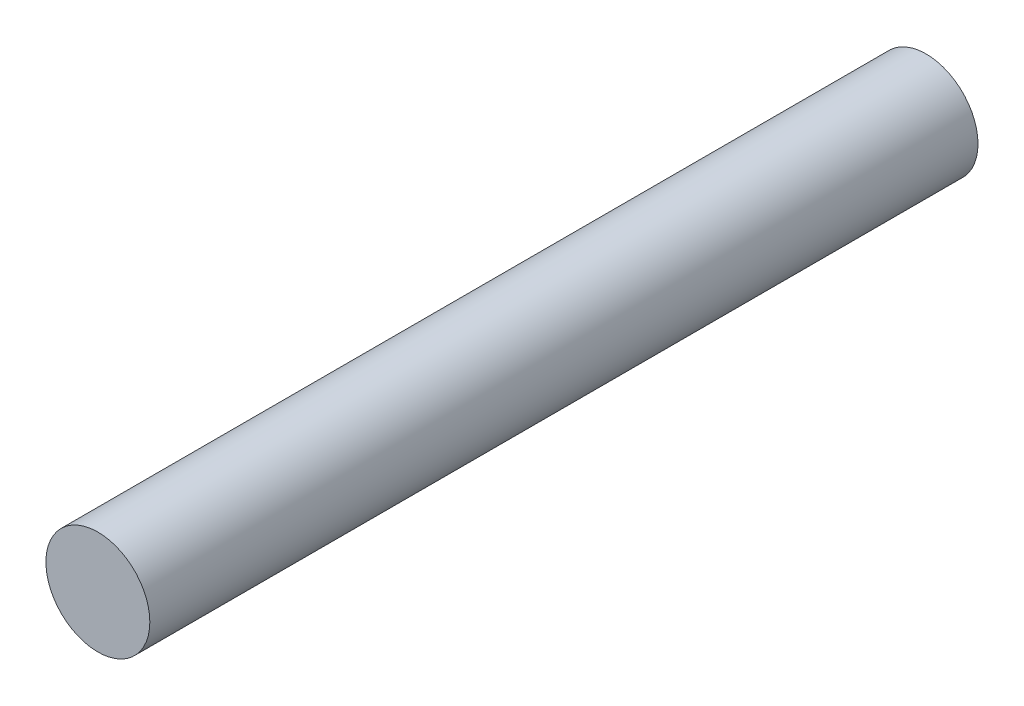
ISO-10303-21;
HEADER;
FILE_DESCRIPTION(('STEP AP214'),'2;1');
FILE_NAME('part.step','',(''),(''),'','','');
FILE_SCHEMA(('AUTOMOTIVE_DESIGN { 1 0 10303 214 1 1 1 1 }'));
ENDSEC;
DATA;
#1=APPLICATION_CONTEXT('core data for automotive mechanical design processes');
#2=APPLICATION_PROTOCOL_DEFINITION('international standard','automotive_design',2000,#1);
#3=PRODUCT_CONTEXT('',#1,'mechanical');
#4=PRODUCT('Part','Part','',(#3));
#5=PRODUCT_RELATED_PRODUCT_CATEGORY('part','',(#4));
#6=PRODUCT_DEFINITION_FORMATION('','',#4);
#7=PRODUCT_DEFINITION_CONTEXT('part definition',#1,'design');
#8=PRODUCT_DEFINITION('design','',#6,#7);
#9=PRODUCT_DEFINITION_SHAPE('','',#8);
#10=(LENGTH_UNIT() NAMED_UNIT(*) SI_UNIT(.MILLI.,.METRE.));
#11=(NAMED_UNIT(*) PLANE_ANGLE_UNIT() SI_UNIT($,.RADIAN.));
#12=(NAMED_UNIT(*) SI_UNIT($,.STERADIAN.) SOLID_ANGLE_UNIT());
#13=UNCERTAINTY_MEASURE_WITH_UNIT(LENGTH_MEASURE(1.E-05),#10,'distance_accuracy_value','');
#14=(GEOMETRIC_REPRESENTATION_CONTEXT(3) GLOBAL_UNCERTAINTY_ASSIGNED_CONTEXT((#13)) GLOBAL_UNIT_ASSIGNED_CONTEXT((#10,
#11,#12)) REPRESENTATION_CONTEXT('',''));
#15=CARTESIAN_POINT('',(0.,0.,0.));
#16=DIRECTION('',(0.,0.,1.));
#17=DIRECTION('',(1.,0.,0.));
#18=AXIS2_PLACEMENT_3D('',#15,#16,#17);
#19=CARTESIAN_POINT('',(0.,0.,787.4));
#20=DIRECTION('',(0.,0.,-1.));
#21=DIRECTION('',(-1.,0.,0.));
#22=AXIS2_PLACEMENT_3D('',#19,#20,#21);
#23=CYLINDRICAL_SURFACE('',#22,49.403);
#24=CARTESIAN_POINT('',(0.,0.,787.4));
#25=DIRECTION('',(0.,0.,1.));
#26=DIRECTION('',(1.,0.,0.));
#27=AXIS2_PLACEMENT_3D('',#24,#25,#26);
#28=CIRCLE('',#27,49.403);
#29=CARTESIAN_POINT('',(49.403,0.,787.4));
#30=VERTEX_POINT('',#29);
#31=EDGE_CURVE('E10',#30,#30,#28,.T.);
#32=ORIENTED_EDGE('',*,*,#31,.F.);
#33=EDGE_LOOP('',(#32));
#34=FACE_BOUND('',#33,.T.);
#35=CARTESIAN_POINT('',(0.,0.,0.));
#36=DIRECTION('',(0.,0.,1.));
#37=DIRECTION('',(1.,0.,0.));
#38=AXIS2_PLACEMENT_3D('',#35,#36,#37);
#39=CIRCLE('',#38,49.403);
#40=CARTESIAN_POINT('',(49.403,0.,0.));
#41=VERTEX_POINT('',#40);
#42=EDGE_CURVE('E34',#41,#41,#39,.T.);
#43=ORIENTED_EDGE('',*,*,#42,.T.);
#44=EDGE_LOOP('',(#43));
#45=FACE_BOUND('',#44,.T.);
#46=ADVANCED_FACE('F31',(#34,#45),#23,.T.);
#47=CARTESIAN_POINT('',(0.,0.,787.4));
#48=DIRECTION('',(0.,0.,1.));
#49=DIRECTION('',(1.,0.,0.));
#50=AXIS2_PLACEMENT_3D('',#47,#48,#49);
#51=PLANE('',#50);
#52=ORIENTED_EDGE('',*,*,#31,.T.);
#53=EDGE_LOOP('',(#52));
#54=FACE_BOUND('',#53,.T.);
#55=ADVANCED_FACE('F46',(#54),#51,.T.);
#56=CARTESIAN_POINT('',(0.,0.,0.));
#57=DIRECTION('',(0.,0.,1.));
#58=DIRECTION('',(1.,0.,0.));
#59=AXIS2_PLACEMENT_3D('',#56,#57,#58);
#60=PLANE('',#59);
#61=ORIENTED_EDGE('',*,*,#42,.F.);
#62=EDGE_LOOP('',(#61));
#63=FACE_BOUND('',#62,.T.);
#64=ADVANCED_FACE('F44',(#63),#60,.F.);
#65=CLOSED_SHELL('',(#46,#55,#64));
#66=MANIFOLD_SOLID_BREP('B2',#65);
#67=ADVANCED_BREP_SHAPE_REPRESENTATION('',(#18,#66),#14);
#68=SHAPE_DEFINITION_REPRESENTATION(#9,#67);
ENDSEC;
END-ISO-10303-21;
